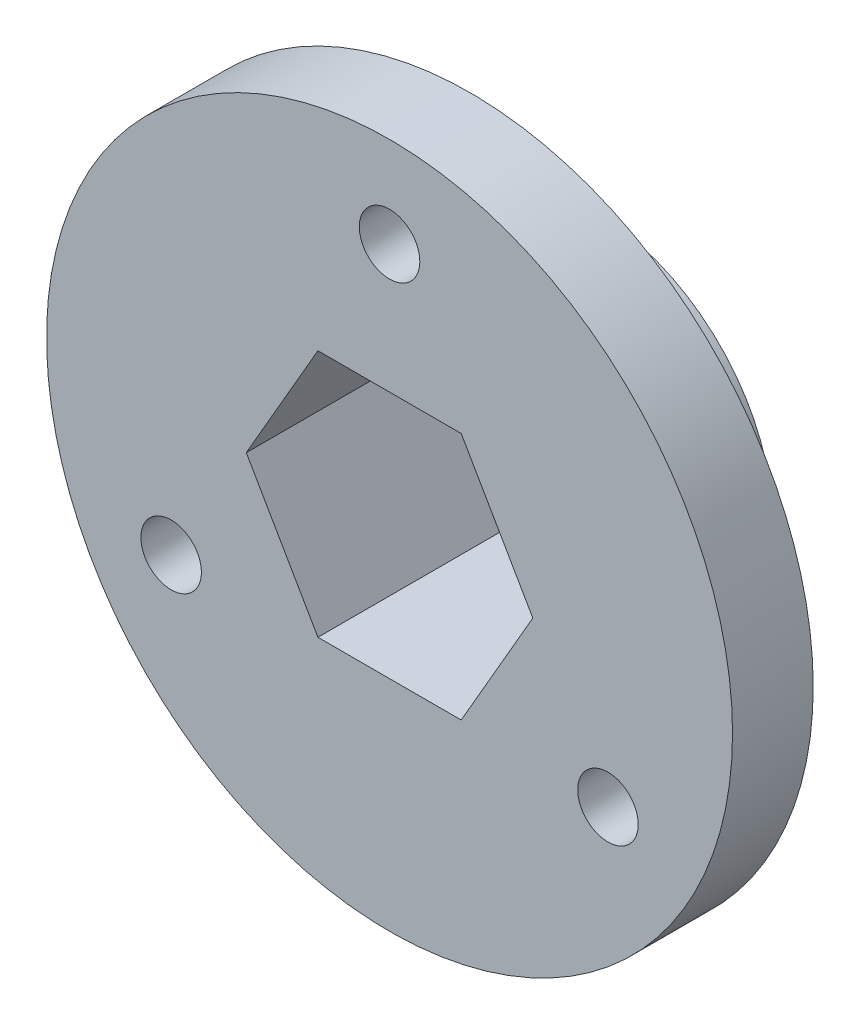
ISO-10303-21;
HEADER;
FILE_DESCRIPTION(('STEP AP214'),'2;1');
FILE_NAME('part.step','',(''),(''),'','','');
FILE_SCHEMA(('AUTOMOTIVE_DESIGN { 1 0 10303 214 1 1 1 1 }'));
ENDSEC;
DATA;
#1=APPLICATION_CONTEXT('core data for automotive mechanical design processes');
#2=APPLICATION_PROTOCOL_DEFINITION('international standard','automotive_design',2000,#1);
#3=PRODUCT_CONTEXT('',#1,'mechanical');
#4=PRODUCT('Part','Part','',(#3));
#5=PRODUCT_RELATED_PRODUCT_CATEGORY('part','',(#4));
#6=PRODUCT_DEFINITION_FORMATION('','',#4);
#7=PRODUCT_DEFINITION_CONTEXT('part definition',#1,'design');
#8=PRODUCT_DEFINITION('design','',#6,#7);
#9=PRODUCT_DEFINITION_SHAPE('','',#8);
#10=(LENGTH_UNIT() NAMED_UNIT(*) SI_UNIT(.MILLI.,.METRE.));
#11=(NAMED_UNIT(*) PLANE_ANGLE_UNIT() SI_UNIT($,.RADIAN.));
#12=(NAMED_UNIT(*) SI_UNIT($,.STERADIAN.) SOLID_ANGLE_UNIT());
#13=UNCERTAINTY_MEASURE_WITH_UNIT(LENGTH_MEASURE(1.E-05),#10,'distance_accuracy_value','');
#14=(GEOMETRIC_REPRESENTATION_CONTEXT(3) GLOBAL_UNCERTAINTY_ASSIGNED_CONTEXT((#13)) GLOBAL_UNIT_ASSIGNED_CONTEXT((#10,
#11,#12)) REPRESENTATION_CONTEXT('',''));
#15=CARTESIAN_POINT('',(0.,0.,0.));
#16=DIRECTION('',(0.,0.,1.));
#17=DIRECTION('',(1.,0.,0.));
#18=AXIS2_PLACEMENT_3D('',#15,#16,#17);
#19=CARTESIAN_POINT('',(0.,0.,4.));
#20=DIRECTION('',(0.,0.,1.));
#21=DIRECTION('',(1.,0.,0.));
#22=AXIS2_PLACEMENT_3D('',#19,#20,#21);
#23=PLANE('',#22);
#24=DIRECTION('',(0.5,0.866025403784438,0.));
#25=VECTOR('',#24,1.);
#26=CARTESIAN_POINT('',(-7.1014083110324,0.,4.));
#27=LINE('',#26,#25);
#28=CARTESIAN_POINT('',(-7.1014083110324,0.,4.));
#29=VERTEX_POINT('',#28);
#30=CARTESIAN_POINT('',(-3.5507041555162,6.15,4.));
#31=VERTEX_POINT('',#30);
#32=EDGE_CURVE('E140',#29,#31,#27,.T.);
#33=ORIENTED_EDGE('',*,*,#32,.T.);
#34=DIRECTION('',(1.,0.,0.));
#35=VECTOR('',#34,1.);
#36=CARTESIAN_POINT('',(-3.5507041555162,6.15,4.));
#37=LINE('',#36,#35);
#38=CARTESIAN_POINT('',(3.5507041555162,6.15,4.));
#39=VERTEX_POINT('',#38);
#40=EDGE_CURVE('E145',#31,#39,#37,.T.);
#41=ORIENTED_EDGE('',*,*,#40,.T.);
#42=DIRECTION('',(0.5,-0.866025403784439,0.));
#43=VECTOR('',#42,1.);
#44=CARTESIAN_POINT('',(3.5507041555162,6.15,4.));
#45=LINE('',#44,#43);
#46=CARTESIAN_POINT('',(7.1014083110324,0.,4.));
#47=VERTEX_POINT('',#46);
#48=EDGE_CURVE('E59',#39,#47,#45,.T.);
#49=ORIENTED_EDGE('',*,*,#48,.T.);
#50=DIRECTION('',(-0.5,-0.866025403784438,0.));
#51=VECTOR('',#50,1.);
#52=CARTESIAN_POINT('',(7.1014083110324,0.,4.));
#53=LINE('',#52,#51);
#54=CARTESIAN_POINT('',(3.5507041555162,-6.15,4.));
#55=VERTEX_POINT('',#54);
#56=EDGE_CURVE('E150',#47,#55,#53,.T.);
#57=ORIENTED_EDGE('',*,*,#56,.T.);
#58=DIRECTION('',(-1.,0.,0.));
#59=VECTOR('',#58,1.);
#60=CARTESIAN_POINT('',(3.5507041555162,-6.15,4.));
#61=LINE('',#60,#59);
#62=CARTESIAN_POINT('',(-3.5507041555162,-6.15,4.));
#63=VERTEX_POINT('',#62);
#64=EDGE_CURVE('E154',#55,#63,#61,.T.);
#65=ORIENTED_EDGE('',*,*,#64,.T.);
#66=DIRECTION('',(-0.5,0.866025403784439,0.));
#67=VECTOR('',#66,1.);
#68=CARTESIAN_POINT('',(-3.5507041555162,-6.15,4.));
#69=LINE('',#68,#67);
#70=EDGE_CURVE('E158',#63,#29,#69,.T.);
#71=ORIENTED_EDGE('',*,*,#70,.T.);
#72=EDGE_LOOP('',(#33,#41,#49,#57,#65,#71));
#73=FACE_BOUND('',#72,.T.);
#74=CARTESIAN_POINT('',(10.8253175473055,-6.25,4.));
#75=DIRECTION('',(0.,0.,1.));
#76=DIRECTION('',(1.,0.,0.));
#77=AXIS2_PLACEMENT_3D('',#74,#75,#76);
#78=CIRCLE('',#77,1.50000000000004);
#79=CARTESIAN_POINT('',(12.3253175473055,-6.25,4.));
#80=VERTEX_POINT('',#79);
#81=EDGE_CURVE('E183',#80,#80,#78,.T.);
#82=ORIENTED_EDGE('',*,*,#81,.F.);
#83=EDGE_LOOP('',(#82));
#84=FACE_BOUND('',#83,.T.);
#85=CARTESIAN_POINT('',(0.,0.,4.));
#86=DIRECTION('',(0.,0.,1.));
#87=DIRECTION('',(1.,0.,0.));
#88=AXIS2_PLACEMENT_3D('',#85,#86,#87);
#89=CIRCLE('',#88,17.);
#90=CARTESIAN_POINT('',(17.,0.,4.));
#91=VERTEX_POINT('',#90);
#92=EDGE_CURVE('E51',#91,#91,#89,.T.);
#93=ORIENTED_EDGE('',*,*,#92,.T.);
#94=EDGE_LOOP('',(#93));
#95=FACE_BOUND('',#94,.T.);
#96=CARTESIAN_POINT('',(0.,12.5,4.));
#97=DIRECTION('',(0.,0.,1.));
#98=DIRECTION('',(1.,0.,0.));
#99=AXIS2_PLACEMENT_3D('',#96,#97,#98);
#100=CIRCLE('',#99,1.5);
#101=CARTESIAN_POINT('',(1.5,12.5,4.));
#102=VERTEX_POINT('',#101);
#103=EDGE_CURVE('E191',#102,#102,#100,.T.);
#104=ORIENTED_EDGE('',*,*,#103,.F.);
#105=EDGE_LOOP('',(#104));
#106=FACE_BOUND('',#105,.T.);
#107=CARTESIAN_POINT('',(-10.8253175473055,-6.25,4.));
#108=DIRECTION('',(0.,0.,1.));
#109=DIRECTION('',(1.,0.,0.));
#110=AXIS2_PLACEMENT_3D('',#107,#108,#109);
#111=CIRCLE('',#110,1.5);
#112=CARTESIAN_POINT('',(-9.32531754730548,-6.25,4.));
#113=VERTEX_POINT('',#112);
#114=EDGE_CURVE('E175',#113,#113,#111,.T.);
#115=ORIENTED_EDGE('',*,*,#114,.F.);
#116=EDGE_LOOP('',(#115));
#117=FACE_BOUND('',#116,.T.);
#118=ADVANCED_FACE('F41',(#73,#84,#95,#106,#117),#23,.T.);
#119=CARTESIAN_POINT('',(0.,0.,0.));
#120=DIRECTION('',(0.,0.,1.));
#121=DIRECTION('',(1.,0.,0.));
#122=AXIS2_PLACEMENT_3D('',#119,#120,#121);
#123=PLANE('',#122);
#124=CARTESIAN_POINT('',(0.,0.,0.));
#125=DIRECTION('',(0.,0.,-1.));
#126=DIRECTION('',(-1.,0.,0.));
#127=AXIS2_PLACEMENT_3D('',#124,#125,#126);
#128=CIRCLE('',#127,9.);
#129=CARTESIAN_POINT('',(-9.,0.,0.));
#130=VERTEX_POINT('',#129);
#131=EDGE_CURVE('E11',#130,#130,#128,.T.);
#132=ORIENTED_EDGE('',*,*,#131,.F.);
#133=EDGE_LOOP('',(#132));
#134=FACE_BOUND('',#133,.T.);
#135=CARTESIAN_POINT('',(0.,0.,0.));
#136=DIRECTION('',(0.,0.,1.));
#137=DIRECTION('',(1.,0.,0.));
#138=AXIS2_PLACEMENT_3D('',#135,#136,#137);
#139=CIRCLE('',#138,17.);
#140=CARTESIAN_POINT('',(17.,0.,0.));
#141=VERTEX_POINT('',#140);
#142=EDGE_CURVE('E45',#141,#141,#139,.T.);
#143=ORIENTED_EDGE('',*,*,#142,.F.);
#144=EDGE_LOOP('',(#143));
#145=FACE_BOUND('',#144,.T.);
#146=CARTESIAN_POINT('',(0.,12.5,0.));
#147=DIRECTION('',(0.,0.,1.));
#148=DIRECTION('',(1.,0.,0.));
#149=AXIS2_PLACEMENT_3D('',#146,#147,#148);
#150=CIRCLE('',#149,1.5);
#151=CARTESIAN_POINT('',(1.5,12.5,0.));
#152=VERTEX_POINT('',#151);
#153=EDGE_CURVE('E187',#152,#152,#150,.T.);
#154=ORIENTED_EDGE('',*,*,#153,.T.);
#155=EDGE_LOOP('',(#154));
#156=FACE_BOUND('',#155,.T.);
#157=CARTESIAN_POINT('',(10.8253175473055,-6.25,0.));
#158=DIRECTION('',(0.,0.,1.));
#159=DIRECTION('',(1.,0.,0.));
#160=AXIS2_PLACEMENT_3D('',#157,#158,#159);
#161=CIRCLE('',#160,1.50000000000004);
#162=CARTESIAN_POINT('',(12.3253175473055,-6.25,0.));
#163=VERTEX_POINT('',#162);
#164=EDGE_CURVE('E179',#163,#163,#161,.T.);
#165=ORIENTED_EDGE('',*,*,#164,.T.);
#166=EDGE_LOOP('',(#165));
#167=FACE_BOUND('',#166,.T.);
#168=CARTESIAN_POINT('',(-10.8253175473055,-6.25,0.));
#169=DIRECTION('',(0.,0.,1.));
#170=DIRECTION('',(1.,0.,0.));
#171=AXIS2_PLACEMENT_3D('',#168,#169,#170);
#172=CIRCLE('',#171,1.5);
#173=CARTESIAN_POINT('',(-9.32531754730548,-6.25,0.));
#174=VERTEX_POINT('',#173);
#175=EDGE_CURVE('E164',#174,#174,#172,.T.);
#176=ORIENTED_EDGE('',*,*,#175,.T.);
#177=EDGE_LOOP('',(#176));
#178=FACE_BOUND('',#177,.T.);
#179=ADVANCED_FACE('F206',(#134,#145,#156,#167,#178),#123,.F.);
#180=CARTESIAN_POINT('',(0.,0.,4.));
#181=DIRECTION('',(0.,0.,-1.));
#182=DIRECTION('',(-1.,0.,0.));
#183=AXIS2_PLACEMENT_3D('',#180,#181,#182);
#184=CYLINDRICAL_SURFACE('',#183,17.);
#185=ORIENTED_EDGE('',*,*,#92,.F.);
#186=EDGE_LOOP('',(#185));
#187=FACE_BOUND('',#186,.T.);
#188=ORIENTED_EDGE('',*,*,#142,.T.);
#189=EDGE_LOOP('',(#188));
#190=FACE_BOUND('',#189,.T.);
#191=ADVANCED_FACE('F43',(#187,#190),#184,.T.);
#192=CARTESIAN_POINT('',(0.,12.5,4.));
#193=DIRECTION('',(0.,0.,-1.));
#194=DIRECTION('',(-1.,0.,0.));
#195=AXIS2_PLACEMENT_3D('',#192,#193,#194);
#196=CYLINDRICAL_SURFACE('',#195,1.5);
#197=ORIENTED_EDGE('',*,*,#103,.T.);
#198=EDGE_LOOP('',(#197));
#199=FACE_BOUND('',#198,.T.);
#200=ORIENTED_EDGE('',*,*,#153,.F.);
#201=EDGE_LOOP('',(#200));
#202=FACE_BOUND('',#201,.T.);
#203=ADVANCED_FACE('F229',(#199,#202),#196,.F.);
#204=CARTESIAN_POINT('',(10.8253175473055,-6.25,4.));
#205=DIRECTION('',(0.,0.,-1.));
#206=DIRECTION('',(-1.,0.,0.));
#207=AXIS2_PLACEMENT_3D('',#204,#205,#206);
#208=CYLINDRICAL_SURFACE('',#207,1.50000000000004);
#209=ORIENTED_EDGE('',*,*,#81,.T.);
#210=EDGE_LOOP('',(#209));
#211=FACE_BOUND('',#210,.T.);
#212=ORIENTED_EDGE('',*,*,#164,.F.);
#213=EDGE_LOOP('',(#212));
#214=FACE_BOUND('',#213,.T.);
#215=ADVANCED_FACE('F219',(#211,#214),#208,.F.);
#216=CARTESIAN_POINT('',(-10.8253175473055,-6.25,4.));
#217=DIRECTION('',(0.,0.,-1.));
#218=DIRECTION('',(-1.,0.,0.));
#219=AXIS2_PLACEMENT_3D('',#216,#217,#218);
#220=CYLINDRICAL_SURFACE('',#219,1.5);
#221=ORIENTED_EDGE('',*,*,#114,.T.);
#222=EDGE_LOOP('',(#221));
#223=FACE_BOUND('',#222,.T.);
#224=ORIENTED_EDGE('',*,*,#175,.F.);
#225=EDGE_LOOP('',(#224));
#226=FACE_BOUND('',#225,.T.);
#227=ADVANCED_FACE('F216',(#223,#226),#220,.F.);
#228=CARTESIAN_POINT('',(-7.1014083110324,0.,4.));
#229=DIRECTION('',(-0.866025403784439,0.5,0.));
#230=DIRECTION('',(-0.5,-0.866025403784438,0.));
#231=AXIS2_PLACEMENT_3D('',#228,#229,#230);
#232=PLANE('',#231);
#233=DIRECTION('',(0.,0.,-1.));
#234=VECTOR('',#233,1.);
#235=CARTESIAN_POINT('',(-7.1014083110324,0.,4.));
#236=LINE('',#235,#234);
#237=CARTESIAN_POINT('',(-7.1014083110324,0.,-6.));
#238=VERTEX_POINT('',#237);
#239=EDGE_CURVE('E67',#29,#238,#236,.T.);
#240=ORIENTED_EDGE('',*,*,#239,.T.);
#241=DIRECTION('',(-0.5,-0.866025403784439,0.));
#242=VECTOR('',#241,1.);
#243=CARTESIAN_POINT('',(-5.3260562332743,3.075,-6.));
#244=LINE('',#243,#242);
#245=CARTESIAN_POINT('',(-3.5507041555162,6.15,-6.));
#246=VERTEX_POINT('',#245);
#247=EDGE_CURVE('E115',#246,#238,#244,.T.);
#248=ORIENTED_EDGE('',*,*,#247,.F.);
#249=DIRECTION('',(0.,0.,-1.));
#250=VECTOR('',#249,1.);
#251=CARTESIAN_POINT('',(-3.5507041555162,6.15,4.));
#252=LINE('',#251,#250);
#253=EDGE_CURVE('E106',#31,#246,#252,.T.);
#254=ORIENTED_EDGE('',*,*,#253,.F.);
#255=ORIENTED_EDGE('',*,*,#32,.F.);
#256=EDGE_LOOP('',(#240,#248,#254,#255));
#257=FACE_BOUND('',#256,.T.);
#258=ADVANCED_FACE('F218',(#257),#232,.F.);
#259=CARTESIAN_POINT('',(-3.5507041555162,-6.15,4.));
#260=DIRECTION('',(-0.866025403784439,-0.5,0.));
#261=DIRECTION('',(0.5,-0.866025403784439,0.));
#262=AXIS2_PLACEMENT_3D('',#259,#260,#261);
#263=PLANE('',#262);
#264=DIRECTION('',(0.,0.,-1.));
#265=VECTOR('',#264,1.);
#266=CARTESIAN_POINT('',(-3.5507041555162,-6.15,4.));
#267=LINE('',#266,#265);
#268=CARTESIAN_POINT('',(-3.5507041555162,-6.15,-6.));
#269=VERTEX_POINT('',#268);
#270=EDGE_CURVE('E165',#63,#269,#267,.T.);
#271=ORIENTED_EDGE('',*,*,#270,.T.);
#272=DIRECTION('',(0.5,-0.866025403784439,0.));
#273=VECTOR('',#272,1.);
#274=CARTESIAN_POINT('',(-5.3260562332743,-3.075,-6.));
#275=LINE('',#274,#273);
#276=EDGE_CURVE('E128',#238,#269,#275,.T.);
#277=ORIENTED_EDGE('',*,*,#276,.F.);
#278=ORIENTED_EDGE('',*,*,#239,.F.);
#279=ORIENTED_EDGE('',*,*,#70,.F.);
#280=EDGE_LOOP('',(#271,#277,#278,#279));
#281=FACE_BOUND('',#280,.T.);
#282=ADVANCED_FACE('F226',(#281),#263,.F.);
#283=CARTESIAN_POINT('',(3.5507041555162,-6.15,4.));
#284=DIRECTION('',(0.,-1.,0.));
#285=DIRECTION('',(0.,0.,-1.));
#286=AXIS2_PLACEMENT_3D('',#283,#284,#285);
#287=PLANE('',#286);
#288=DIRECTION('',(0.,0.,-1.));
#289=VECTOR('',#288,1.);
#290=CARTESIAN_POINT('',(3.5507041555162,-6.15,4.));
#291=LINE('',#290,#289);
#292=CARTESIAN_POINT('',(3.5507041555162,-6.15,-6.));
#293=VERTEX_POINT('',#292);
#294=EDGE_CURVE('E168',#55,#293,#291,.T.);
#295=ORIENTED_EDGE('',*,*,#294,.T.);
#296=DIRECTION('',(1.,0.,0.));
#297=VECTOR('',#296,1.);
#298=CARTESIAN_POINT('',(0.,-6.15,-6.));
#299=LINE('',#298,#297);
#300=EDGE_CURVE('E132',#269,#293,#299,.T.);
#301=ORIENTED_EDGE('',*,*,#300,.F.);
#302=ORIENTED_EDGE('',*,*,#270,.F.);
#303=ORIENTED_EDGE('',*,*,#64,.F.);
#304=EDGE_LOOP('',(#295,#301,#302,#303));
#305=FACE_BOUND('',#304,.T.);
#306=ADVANCED_FACE('F275',(#305),#287,.F.);
#307=CARTESIAN_POINT('',(7.1014083110324,0.,4.));
#308=DIRECTION('',(0.866025403784438,-0.5,0.));
#309=DIRECTION('',(0.5,0.866025403784439,0.));
#310=AXIS2_PLACEMENT_3D('',#307,#308,#309);
#311=PLANE('',#310);
#312=DIRECTION('',(0.,0.,-1.));
#313=VECTOR('',#312,1.);
#314=CARTESIAN_POINT('',(7.1014083110324,0.,4.));
#315=LINE('',#314,#313);
#316=CARTESIAN_POINT('',(7.1014083110324,0.,-6.));
#317=VERTEX_POINT('',#316);
#318=EDGE_CURVE('E105',#47,#317,#315,.T.);
#319=ORIENTED_EDGE('',*,*,#318,.T.);
#320=DIRECTION('',(0.5,0.866025403784439,0.));
#321=VECTOR('',#320,1.);
#322=CARTESIAN_POINT('',(5.3260562332743,-3.075,-6.));
#323=LINE('',#322,#321);
#324=EDGE_CURVE('E122',#293,#317,#323,.T.);
#325=ORIENTED_EDGE('',*,*,#324,.F.);
#326=ORIENTED_EDGE('',*,*,#294,.F.);
#327=ORIENTED_EDGE('',*,*,#56,.F.);
#328=EDGE_LOOP('',(#319,#325,#326,#327));
#329=FACE_BOUND('',#328,.T.);
#330=ADVANCED_FACE('F285',(#329),#311,.F.);
#331=CARTESIAN_POINT('',(3.5507041555162,6.15,4.));
#332=DIRECTION('',(0.866025403784439,0.5,0.));
#333=DIRECTION('',(-0.5,0.866025403784439,0.));
#334=AXIS2_PLACEMENT_3D('',#331,#332,#333);
#335=PLANE('',#334);
#336=DIRECTION('',(0.,0.,-1.));
#337=VECTOR('',#336,1.);
#338=CARTESIAN_POINT('',(3.5507041555162,6.15,4.));
#339=LINE('',#338,#337);
#340=CARTESIAN_POINT('',(3.5507041555162,6.15,-6.));
#341=VERTEX_POINT('',#340);
#342=EDGE_CURVE('E96',#39,#341,#339,.T.);
#343=ORIENTED_EDGE('',*,*,#342,.T.);
#344=DIRECTION('',(-0.5,0.866025403784439,0.));
#345=VECTOR('',#344,1.);
#346=CARTESIAN_POINT('',(5.3260562332743,3.075,-6.));
#347=LINE('',#346,#345);
#348=EDGE_CURVE('E100',#317,#341,#347,.T.);
#349=ORIENTED_EDGE('',*,*,#348,.F.);
#350=ORIENTED_EDGE('',*,*,#318,.F.);
#351=ORIENTED_EDGE('',*,*,#48,.F.);
#352=EDGE_LOOP('',(#343,#349,#350,#351));
#353=FACE_BOUND('',#352,.T.);
#354=ADVANCED_FACE('F98',(#353),#335,.F.);
#355=CARTESIAN_POINT('',(-3.5507041555162,6.15,4.));
#356=DIRECTION('',(0.,1.,0.));
#357=DIRECTION('',(0.,0.,1.));
#358=AXIS2_PLACEMENT_3D('',#355,#356,#357);
#359=PLANE('',#358);
#360=ORIENTED_EDGE('',*,*,#253,.T.);
#361=DIRECTION('',(-1.,0.,0.));
#362=VECTOR('',#361,1.);
#363=CARTESIAN_POINT('',(0.,6.15,-6.));
#364=LINE('',#363,#362);
#365=EDGE_CURVE('E109',#341,#246,#364,.T.);
#366=ORIENTED_EDGE('',*,*,#365,.F.);
#367=ORIENTED_EDGE('',*,*,#342,.F.);
#368=ORIENTED_EDGE('',*,*,#40,.F.);
#369=EDGE_LOOP('',(#360,#366,#367,#368));
#370=FACE_BOUND('',#369,.T.);
#371=ADVANCED_FACE('F110',(#370),#359,.F.);
#372=CARTESIAN_POINT('',(0.,0.,-6.));
#373=DIRECTION('',(0.,0.,1.));
#374=DIRECTION('',(1.,0.,0.));
#375=AXIS2_PLACEMENT_3D('',#372,#373,#374);
#376=CYLINDRICAL_SURFACE('',#375,9.);
#377=CARTESIAN_POINT('',(0.,0.,-6.));
#378=DIRECTION('',(0.,0.,-1.));
#379=DIRECTION('',(-1.,0.,0.));
#380=AXIS2_PLACEMENT_3D('',#377,#378,#379);
#381=CIRCLE('',#380,9.);
#382=CARTESIAN_POINT('',(-9.,0.,-6.));
#383=VERTEX_POINT('',#382);
#384=EDGE_CURVE('E137',#383,#383,#381,.T.);
#385=ORIENTED_EDGE('',*,*,#384,.F.);
#386=EDGE_LOOP('',(#385));
#387=FACE_BOUND('',#386,.T.);
#388=ORIENTED_EDGE('',*,*,#131,.T.);
#389=EDGE_LOOP('',(#388));
#390=FACE_BOUND('',#389,.T.);
#391=ADVANCED_FACE('F315',(#387,#390),#376,.T.);
#392=CARTESIAN_POINT('',(0.,0.,-6.));
#393=DIRECTION('',(0.,0.,-1.));
#394=DIRECTION('',(-1.,0.,0.));
#395=AXIS2_PLACEMENT_3D('',#392,#393,#394);
#396=PLANE('',#395);
#397=ORIENTED_EDGE('',*,*,#348,.T.);
#398=ORIENTED_EDGE('',*,*,#365,.T.);
#399=ORIENTED_EDGE('',*,*,#247,.T.);
#400=ORIENTED_EDGE('',*,*,#276,.T.);
#401=ORIENTED_EDGE('',*,*,#300,.T.);
#402=ORIENTED_EDGE('',*,*,#324,.T.);
#403=EDGE_LOOP('',(#397,#398,#399,#400,#401,#402));
#404=FACE_BOUND('',#403,.T.);
#405=ORIENTED_EDGE('',*,*,#384,.T.);
#406=EDGE_LOOP('',(#405));
#407=FACE_BOUND('',#406,.T.);
#408=ADVANCED_FACE('F118',(#404,#407),#396,.T.);
#409=CLOSED_SHELL('',(#118,#179,#191,#203,#215,#227,#258,#282,#306,#330,#354,#371,#391,#408));
#410=MANIFOLD_SOLID_BREP('B2',#409);
#411=ADVANCED_BREP_SHAPE_REPRESENTATION('',(#18,#410),#14);
#412=SHAPE_DEFINITION_REPRESENTATION(#9,#411);
ENDSEC;
END-ISO-10303-21;
